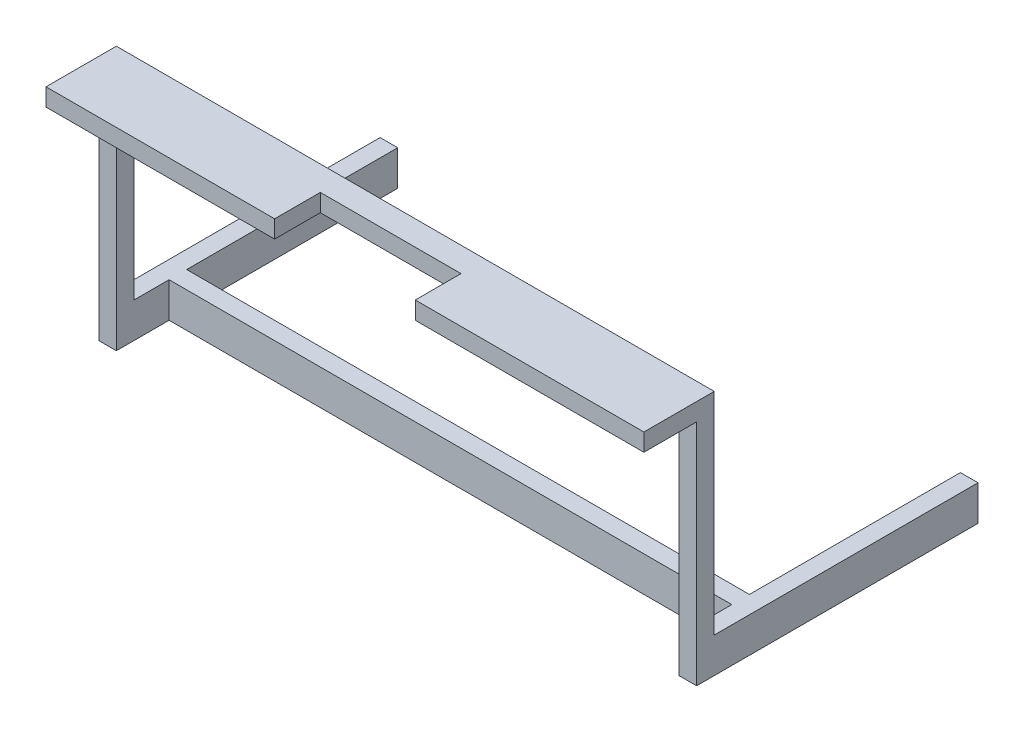
ISO-10303-21;
HEADER;
FILE_DESCRIPTION(('STEP AP214'),'2;1');
FILE_NAME('part.step','',(''),(''),'','','');
FILE_SCHEMA(('AUTOMOTIVE_DESIGN { 1 0 10303 214 1 1 1 1 }'));
ENDSEC;
DATA;
#1=APPLICATION_CONTEXT('core data for automotive mechanical design processes');
#2=APPLICATION_PROTOCOL_DEFINITION('international standard','automotive_design',2000,#1);
#3=PRODUCT_CONTEXT('',#1,'mechanical');
#4=PRODUCT('Part','Part','',(#3));
#5=PRODUCT_RELATED_PRODUCT_CATEGORY('part','',(#4));
#6=PRODUCT_DEFINITION_FORMATION('','',#4);
#7=PRODUCT_DEFINITION_CONTEXT('part definition',#1,'design');
#8=PRODUCT_DEFINITION('design','',#6,#7);
#9=PRODUCT_DEFINITION_SHAPE('','',#8);
#10=(LENGTH_UNIT() NAMED_UNIT(*) SI_UNIT(.MILLI.,.METRE.));
#11=(NAMED_UNIT(*) PLANE_ANGLE_UNIT() SI_UNIT($,.RADIAN.));
#12=(NAMED_UNIT(*) SI_UNIT($,.STERADIAN.) SOLID_ANGLE_UNIT());
#13=UNCERTAINTY_MEASURE_WITH_UNIT(LENGTH_MEASURE(1.E-05),#10,'distance_accuracy_value','');
#14=(GEOMETRIC_REPRESENTATION_CONTEXT(3) GLOBAL_UNCERTAINTY_ASSIGNED_CONTEXT((#13)) GLOBAL_UNIT_ASSIGNED_CONTEXT((#10,
#11,#12)) REPRESENTATION_CONTEXT('',''));
#15=CARTESIAN_POINT('',(0.,0.,0.));
#16=DIRECTION('',(0.,0.,1.));
#17=DIRECTION('',(1.,0.,0.));
#18=AXIS2_PLACEMENT_3D('',#15,#16,#17);
#19=CARTESIAN_POINT('',(170.,70.,15.));
#20=DIRECTION('',(0.,0.,-1.));
#21=DIRECTION('',(0.,1.,0.));
#22=AXIS2_PLACEMENT_3D('',#19,#20,#21);
#23=PLANE('',#22);
#24=DIRECTION('',(-1.,0.,0.));
#25=VECTOR('',#24,1.);
#26=CARTESIAN_POINT('',(170.,65.,15.));
#27=LINE('',#26,#25);
#28=CARTESIAN_POINT('',(65.,65.,15.));
#29=VERTEX_POINT('',#28);
#30=CARTESIAN_POINT('',(0.,65.,15.));
#31=VERTEX_POINT('',#30);
#32=EDGE_CURVE('E206',#29,#31,#27,.T.);
#33=ORIENTED_EDGE('',*,*,#32,.F.);
#34=DIRECTION('',(0.,1.,0.));
#35=VECTOR('',#34,1.);
#36=CARTESIAN_POINT('',(65.,65.,15.));
#37=LINE('',#36,#35);
#38=CARTESIAN_POINT('',(65.,70.,15.));
#39=VERTEX_POINT('',#38);
#40=EDGE_CURVE('E358',#29,#39,#37,.T.);
#41=ORIENTED_EDGE('',*,*,#40,.T.);
#42=DIRECTION('',(-1.,0.,0.));
#43=VECTOR('',#42,1.);
#44=CARTESIAN_POINT('',(170.,70.,15.));
#45=LINE('',#44,#43);
#46=CARTESIAN_POINT('',(0.,70.,15.));
#47=VERTEX_POINT('',#46);
#48=EDGE_CURVE('E205',#39,#47,#45,.T.);
#49=ORIENTED_EDGE('',*,*,#48,.T.);
#50=DIRECTION('',(0.,-1.,0.));
#51=VECTOR('',#50,1.);
#52=CARTESIAN_POINT('',(0.,70.,15.));
#53=LINE('',#52,#51);
#54=EDGE_CURVE('E265',#47,#31,#53,.T.);
#55=ORIENTED_EDGE('',*,*,#54,.T.);
#56=EDGE_LOOP('',(#33,#41,#49,#55));
#57=FACE_BOUND('',#56,.T.);
#58=ADVANCED_FACE('F32',(#57),#23,.F.);
#59=CARTESIAN_POINT('',(170.,0.,0.));
#60=DIRECTION('',(0.,0.,-1.));
#61=DIRECTION('',(-1.,0.,0.));
#62=AXIS2_PLACEMENT_3D('',#59,#60,#61);
#63=PLANE('',#62);
#64=DIRECTION('',(0.,-1.,0.));
#65=VECTOR('',#64,1.);
#66=CARTESIAN_POINT('',(165.,65.,0.));
#67=LINE('',#66,#65);
#68=CARTESIAN_POINT('',(165.,65.,0.));
#69=VERTEX_POINT('',#68);
#70=CARTESIAN_POINT('',(165.,0.,0.));
#71=VERTEX_POINT('',#70);
#72=EDGE_CURVE('E55',#69,#71,#67,.T.);
#73=ORIENTED_EDGE('',*,*,#72,.T.);
#74=DIRECTION('',(-1.,0.,0.));
#75=VECTOR('',#74,1.);
#76=CARTESIAN_POINT('',(170.,0.,0.));
#77=LINE('',#76,#75);
#78=CARTESIAN_POINT('',(170.,0.,0.));
#79=VERTEX_POINT('',#78);
#80=EDGE_CURVE('E11',#79,#71,#77,.T.);
#81=ORIENTED_EDGE('',*,*,#80,.F.);
#82=DIRECTION('',(0.,-1.,0.));
#83=VECTOR('',#82,1.);
#84=CARTESIAN_POINT('',(170.,0.,0.));
#85=LINE('',#84,#83);
#86=CARTESIAN_POINT('',(170.,65.,0.));
#87=VERTEX_POINT('',#86);
#88=EDGE_CURVE('E269',#87,#79,#85,.T.);
#89=ORIENTED_EDGE('',*,*,#88,.F.);
#90=DIRECTION('',(-1.,0.,0.));
#91=VECTOR('',#90,1.);
#92=CARTESIAN_POINT('',(170.,65.,0.));
#93=LINE('',#92,#91);
#94=EDGE_CURVE('E209',#87,#69,#93,.T.);
#95=ORIENTED_EDGE('',*,*,#94,.T.);
#96=EDGE_LOOP('',(#73,#81,#89,#95));
#97=FACE_BOUND('',#96,.T.);
#98=ADVANCED_FACE('F405',(#97),#63,.F.);
#99=CARTESIAN_POINT('',(170.,9.99999999999999,-5.));
#100=DIRECTION('',(0.,0.,1.));
#101=DIRECTION('',(1.,0.,0.));
#102=AXIS2_PLACEMENT_3D('',#99,#100,#101);
#103=PLANE('',#102);
#104=DIRECTION('',(-1.,0.,0.));
#105=VECTOR('',#104,1.);
#106=CARTESIAN_POINT('',(170.,9.99999999999999,-5.));
#107=LINE('',#106,#105);
#108=CARTESIAN_POINT('',(170.,9.99999999999999,-5.));
#109=VERTEX_POINT('',#108);
#110=CARTESIAN_POINT('',(165.,9.99999999999999,-5.));
#111=VERTEX_POINT('',#110);
#112=EDGE_CURVE('E217',#109,#111,#107,.T.);
#113=ORIENTED_EDGE('',*,*,#112,.T.);
#114=DIRECTION('',(0.,-1.,0.));
#115=VECTOR('',#114,1.);
#116=CARTESIAN_POINT('',(165.,65.,-5.));
#117=LINE('',#116,#115);
#118=CARTESIAN_POINT('',(165.,65.,-5.));
#119=VERTEX_POINT('',#118);
#120=EDGE_CURVE('E356',#119,#111,#117,.T.);
#121=ORIENTED_EDGE('',*,*,#120,.F.);
#122=DIRECTION('',(1.,0.,0.));
#123=VECTOR('',#122,1.);
#124=CARTESIAN_POINT('',(5.,65.,-5.));
#125=LINE('',#124,#123);
#126=CARTESIAN_POINT('',(5.,65.,-5.));
#127=VERTEX_POINT('',#126);
#128=EDGE_CURVE('E350',#127,#119,#125,.T.);
#129=ORIENTED_EDGE('',*,*,#128,.F.);
#130=DIRECTION('',(0.,1.,0.));
#131=VECTOR('',#130,1.);
#132=CARTESIAN_POINT('',(5.,9.99999999999999,-5.));
#133=LINE('',#132,#131);
#134=CARTESIAN_POINT('',(5.,9.99999999999999,-5.));
#135=VERTEX_POINT('',#134);
#136=EDGE_CURVE('E353',#135,#127,#133,.T.);
#137=ORIENTED_EDGE('',*,*,#136,.F.);
#138=CARTESIAN_POINT('',(0.,9.99999999999999,-5.));
#139=VERTEX_POINT('',#138);
#140=EDGE_CURVE('E216',#135,#139,#107,.T.);
#141=ORIENTED_EDGE('',*,*,#140,.T.);
#142=DIRECTION('',(0.,1.,0.));
#143=VECTOR('',#142,1.);
#144=CARTESIAN_POINT('',(0.,9.99999999999999,-5.));
#145=LINE('',#144,#143);
#146=CARTESIAN_POINT('',(0.,70.,-5.));
#147=VERTEX_POINT('',#146);
#148=EDGE_CURVE('E257',#139,#147,#145,.T.);
#149=ORIENTED_EDGE('',*,*,#148,.T.);
#150=DIRECTION('',(-1.,0.,0.));
#151=VECTOR('',#150,1.);
#152=CARTESIAN_POINT('',(170.,70.,-5.));
#153=LINE('',#152,#151);
#154=CARTESIAN_POINT('',(170.,70.,-5.));
#155=VERTEX_POINT('',#154);
#156=EDGE_CURVE('E213',#155,#147,#153,.T.);
#157=ORIENTED_EDGE('',*,*,#156,.F.);
#158=DIRECTION('',(0.,1.,0.));
#159=VECTOR('',#158,1.);
#160=CARTESIAN_POINT('',(170.,9.99999999999999,-5.));
#161=LINE('',#160,#159);
#162=EDGE_CURVE('E287',#109,#155,#161,.T.);
#163=ORIENTED_EDGE('',*,*,#162,.F.);
#164=EDGE_LOOP('',(#113,#121,#129,#137,#141,#149,#157,#163));
#165=FACE_BOUND('',#164,.T.);
#166=ADVANCED_FACE('F389',(#165),#103,.F.);
#167=CARTESIAN_POINT('',(170.,0.,-80.));
#168=DIRECTION('',(0.,0.,1.));
#169=DIRECTION('',(1.,0.,0.));
#170=AXIS2_PLACEMENT_3D('',#167,#168,#169);
#171=PLANE('',#170);
#172=DIRECTION('',(-1.,0.,0.));
#173=VECTOR('',#172,1.);
#174=CARTESIAN_POINT('',(170.,10.,-80.));
#175=LINE('',#174,#173);
#176=CARTESIAN_POINT('',(5.,10.,-80.));
#177=VERTEX_POINT('',#176);
#178=CARTESIAN_POINT('',(0.,10.,-80.));
#179=VERTEX_POINT('',#178);
#180=EDGE_CURVE('E220',#177,#179,#175,.T.);
#181=ORIENTED_EDGE('',*,*,#180,.F.);
#182=DIRECTION('',(0.,1.,0.));
#183=VECTOR('',#182,1.);
#184=CARTESIAN_POINT('',(5.,0.,-80.));
#185=LINE('',#184,#183);
#186=CARTESIAN_POINT('',(5.,0.,-80.));
#187=VERTEX_POINT('',#186);
#188=EDGE_CURVE('E239',#187,#177,#185,.T.);
#189=ORIENTED_EDGE('',*,*,#188,.F.);
#190=DIRECTION('',(-1.,0.,0.));
#191=VECTOR('',#190,1.);
#192=CARTESIAN_POINT('',(170.,0.,-80.));
#193=LINE('',#192,#191);
#194=CARTESIAN_POINT('',(0.,0.,-80.));
#195=VERTEX_POINT('',#194);
#196=EDGE_CURVE('E223',#187,#195,#193,.T.);
#197=ORIENTED_EDGE('',*,*,#196,.T.);
#198=DIRECTION('',(0.,1.,0.));
#199=VECTOR('',#198,1.);
#200=CARTESIAN_POINT('',(0.,0.,-80.));
#201=LINE('',#200,#199);
#202=EDGE_CURVE('E238',#195,#179,#201,.T.);
#203=ORIENTED_EDGE('',*,*,#202,.T.);
#204=EDGE_LOOP('',(#181,#189,#197,#203));
#205=FACE_BOUND('',#204,.T.);
#206=ADVANCED_FACE('F236',(#205),#171,.F.);
#207=CARTESIAN_POINT('',(5.,0.,0.));
#208=VERTEX_POINT('',#207);
#209=CARTESIAN_POINT('',(0.,0.,0.));
#210=VERTEX_POINT('',#209);
#211=EDGE_CURVE('E40',#208,#210,#77,.T.);
#212=ORIENTED_EDGE('',*,*,#211,.F.);
#213=DIRECTION('',(0.,1.,0.));
#214=VECTOR('',#213,1.);
#215=CARTESIAN_POINT('',(5.,9.99999999999999,0.));
#216=LINE('',#215,#214);
#217=CARTESIAN_POINT('',(5.,65.,0.));
#218=VERTEX_POINT('',#217);
#219=EDGE_CURVE('E348',#208,#218,#216,.T.);
#220=ORIENTED_EDGE('',*,*,#219,.T.);
#221=CARTESIAN_POINT('',(0.,65.,0.));
#222=VERTEX_POINT('',#221);
#223=EDGE_CURVE('E293',#218,#222,#93,.T.);
#224=ORIENTED_EDGE('',*,*,#223,.T.);
#225=DIRECTION('',(0.,-1.,0.));
#226=VECTOR('',#225,1.);
#227=CARTESIAN_POINT('',(0.,0.,0.));
#228=LINE('',#227,#226);
#229=EDGE_CURVE('E249',#222,#210,#228,.T.);
#230=ORIENTED_EDGE('',*,*,#229,.T.);
#231=EDGE_LOOP('',(#212,#220,#224,#230));
#232=FACE_BOUND('',#231,.T.);
#233=ADVANCED_FACE('F34',(#232),#63,.F.);
#234=CARTESIAN_POINT('',(170.,0.,-20.));
#235=DIRECTION('',(0.,1.,0.));
#236=DIRECTION('',(0.,0.,1.));
#237=AXIS2_PLACEMENT_3D('',#234,#235,#236);
#238=PLANE('',#237);
#239=ORIENTED_EDGE('',*,*,#80,.T.);
#240=DIRECTION('',(0.,0.,-1.));
#241=VECTOR('',#240,1.);
#242=CARTESIAN_POINT('',(165.,0.,-15.));
#243=LINE('',#242,#241);
#244=CARTESIAN_POINT('',(165.,0.,-15.));
#245=VERTEX_POINT('',#244);
#246=EDGE_CURVE('E342',#71,#245,#243,.T.);
#247=ORIENTED_EDGE('',*,*,#246,.T.);
#248=DIRECTION('',(-1.,0.,0.));
#249=VECTOR('',#248,1.);
#250=CARTESIAN_POINT('',(5.00000000000001,0.,-15.));
#251=LINE('',#250,#249);
#252=CARTESIAN_POINT('',(5.00000000000001,0.,-15.));
#253=VERTEX_POINT('',#252);
#254=EDGE_CURVE('E327',#245,#253,#251,.T.);
#255=ORIENTED_EDGE('',*,*,#254,.T.);
#256=DIRECTION('',(0.,0.,1.));
#257=VECTOR('',#256,1.);
#258=CARTESIAN_POINT('',(5.00000000000001,0.,-15.));
#259=LINE('',#258,#257);
#260=EDGE_CURVE('E332',#253,#208,#259,.T.);
#261=ORIENTED_EDGE('',*,*,#260,.T.);
#262=ORIENTED_EDGE('',*,*,#211,.T.);
#263=DIRECTION('',(0.,0.,-1.));
#264=VECTOR('',#263,1.);
#265=CARTESIAN_POINT('',(0.,0.,-20.));
#266=LINE('',#265,#264);
#267=EDGE_CURVE('E243',#210,#195,#266,.T.);
#268=ORIENTED_EDGE('',*,*,#267,.T.);
#269=ORIENTED_EDGE('',*,*,#196,.F.);
#270=DIRECTION('',(0.,0.,1.));
#271=VECTOR('',#270,1.);
#272=CARTESIAN_POINT('',(5.,0.,-80.));
#273=LINE('',#272,#271);
#274=CARTESIAN_POINT('',(5.00000000000001,0.,-20.));
#275=VERTEX_POINT('',#274);
#276=EDGE_CURVE('E316',#187,#275,#273,.T.);
#277=ORIENTED_EDGE('',*,*,#276,.T.);
#278=DIRECTION('',(1.,0.,0.));
#279=VECTOR('',#278,1.);
#280=CARTESIAN_POINT('',(5.00000000000001,0.,-20.));
#281=LINE('',#280,#279);
#282=CARTESIAN_POINT('',(165.,0.,-20.));
#283=VERTEX_POINT('',#282);
#284=EDGE_CURVE('E313',#275,#283,#281,.T.);
#285=ORIENTED_EDGE('',*,*,#284,.T.);
#286=DIRECTION('',(0.,0.,-1.));
#287=VECTOR('',#286,1.);
#288=CARTESIAN_POINT('',(165.,0.,-20.));
#289=LINE('',#288,#287);
#290=CARTESIAN_POINT('',(165.,0.,-80.));
#291=VERTEX_POINT('',#290);
#292=EDGE_CURVE('E308',#283,#291,#289,.T.);
#293=ORIENTED_EDGE('',*,*,#292,.T.);
#294=CARTESIAN_POINT('',(170.,0.,-80.));
#295=VERTEX_POINT('',#294);
#296=EDGE_CURVE('E224',#295,#291,#193,.T.);
#297=ORIENTED_EDGE('',*,*,#296,.F.);
#298=DIRECTION('',(0.,0.,-1.));
#299=VECTOR('',#298,1.);
#300=CARTESIAN_POINT('',(170.,0.,0.));
#301=LINE('',#300,#299);
#302=EDGE_CURVE('E273',#79,#295,#301,.T.);
#303=ORIENTED_EDGE('',*,*,#302,.F.);
#304=EDGE_LOOP('',(#239,#247,#255,#261,#262,#268,#269,#277,#285,#293,#297,#303));
#305=FACE_BOUND('',#304,.T.);
#306=ADVANCED_FACE('F244',(#305),#238,.F.);
#307=ORIENTED_EDGE('',*,*,#296,.T.);
#308=DIRECTION('',(0.,1.,0.));
#309=VECTOR('',#308,1.);
#310=CARTESIAN_POINT('',(165.,0.,-80.));
#311=LINE('',#310,#309);
#312=CARTESIAN_POINT('',(165.,10.,-80.));
#313=VERTEX_POINT('',#312);
#314=EDGE_CURVE('E295',#291,#313,#311,.T.);
#315=ORIENTED_EDGE('',*,*,#314,.T.);
#316=CARTESIAN_POINT('',(170.,10.,-80.));
#317=VERTEX_POINT('',#316);
#318=EDGE_CURVE('E221',#317,#313,#175,.T.);
#319=ORIENTED_EDGE('',*,*,#318,.F.);
#320=DIRECTION('',(0.,1.,0.));
#321=VECTOR('',#320,1.);
#322=CARTESIAN_POINT('',(170.,0.,-80.));
#323=LINE('',#322,#321);
#324=EDGE_CURVE('E278',#295,#317,#323,.T.);
#325=ORIENTED_EDGE('',*,*,#324,.F.);
#326=EDGE_LOOP('',(#307,#315,#319,#325));
#327=FACE_BOUND('',#326,.T.);
#328=ADVANCED_FACE('F399',(#327),#171,.F.);
#329=CARTESIAN_POINT('',(170.,9.99999999999999,-15.));
#330=DIRECTION('',(0.,-1.,0.));
#331=DIRECTION('',(0.,0.,-1.));
#332=AXIS2_PLACEMENT_3D('',#329,#330,#331);
#333=PLANE('',#332);
#334=ORIENTED_EDGE('',*,*,#140,.F.);
#335=DIRECTION('',(0.,0.,1.));
#336=VECTOR('',#335,1.);
#337=CARTESIAN_POINT('',(5.00000000000001,9.99999999999999,-15.));
#338=LINE('',#337,#336);
#339=CARTESIAN_POINT('',(5.00000000000001,9.99999999999999,-15.));
#340=VERTEX_POINT('',#339);
#341=EDGE_CURVE('E336',#340,#135,#338,.T.);
#342=ORIENTED_EDGE('',*,*,#341,.F.);
#343=DIRECTION('',(-1.,0.,0.));
#344=VECTOR('',#343,1.);
#345=CARTESIAN_POINT('',(5.00000000000001,9.99999999999999,-15.));
#346=LINE('',#345,#344);
#347=CARTESIAN_POINT('',(165.,9.99999999999999,-15.));
#348=VERTEX_POINT('',#347);
#349=EDGE_CURVE('E329',#348,#340,#346,.T.);
#350=ORIENTED_EDGE('',*,*,#349,.F.);
#351=DIRECTION('',(0.,0.,-1.));
#352=VECTOR('',#351,1.);
#353=CARTESIAN_POINT('',(165.,9.99999999999999,-15.));
#354=LINE('',#353,#352);
#355=EDGE_CURVE('E333',#111,#348,#354,.T.);
#356=ORIENTED_EDGE('',*,*,#355,.F.);
#357=ORIENTED_EDGE('',*,*,#112,.F.);
#358=DIRECTION('',(0.,0.,1.));
#359=VECTOR('',#358,1.);
#360=CARTESIAN_POINT('',(170.,10.,-80.));
#361=LINE('',#360,#359);
#362=EDGE_CURVE('E285',#317,#109,#361,.T.);
#363=ORIENTED_EDGE('',*,*,#362,.F.);
#364=ORIENTED_EDGE('',*,*,#318,.T.);
#365=DIRECTION('',(0.,0.,-1.));
#366=VECTOR('',#365,1.);
#367=CARTESIAN_POINT('',(165.,9.99999999999999,-20.));
#368=LINE('',#367,#366);
#369=CARTESIAN_POINT('',(165.,9.99999999999999,-20.));
#370=VERTEX_POINT('',#369);
#371=EDGE_CURVE('E302',#370,#313,#368,.T.);
#372=ORIENTED_EDGE('',*,*,#371,.F.);
#373=DIRECTION('',(1.,0.,0.));
#374=VECTOR('',#373,1.);
#375=CARTESIAN_POINT('',(5.00000000000001,9.99999999999999,-20.));
#376=LINE('',#375,#374);
#377=CARTESIAN_POINT('',(5.,9.99999999999999,-20.));
#378=VERTEX_POINT('',#377);
#379=EDGE_CURVE('E321',#378,#370,#376,.T.);
#380=ORIENTED_EDGE('',*,*,#379,.F.);
#381=DIRECTION('',(0.,0.,1.));
#382=VECTOR('',#381,1.);
#383=CARTESIAN_POINT('',(5.,10.,-80.));
#384=LINE('',#383,#382);
#385=EDGE_CURVE('E320',#177,#378,#384,.T.);
#386=ORIENTED_EDGE('',*,*,#385,.F.);
#387=ORIENTED_EDGE('',*,*,#180,.T.);
#388=DIRECTION('',(0.,0.,1.));
#389=VECTOR('',#388,1.);
#390=CARTESIAN_POINT('',(0.,9.99999999999999,-15.));
#391=LINE('',#390,#389);
#392=EDGE_CURVE('E255',#179,#139,#391,.T.);
#393=ORIENTED_EDGE('',*,*,#392,.T.);
#394=EDGE_LOOP('',(#334,#342,#350,#356,#357,#363,#364,#372,#380,#386,#387,#393));
#395=FACE_BOUND('',#394,.T.);
#396=ADVANCED_FACE('F394',(#395),#333,.F.);
#397=CARTESIAN_POINT('',(170.,70.,-5.));
#398=DIRECTION('',(0.,-1.,0.));
#399=DIRECTION('',(0.,0.,-1.));
#400=AXIS2_PLACEMENT_3D('',#397,#398,#399);
#401=PLANE('',#400);
#402=ORIENTED_EDGE('',*,*,#48,.F.);
#403=DIRECTION('',(0.,0.,1.));
#404=VECTOR('',#403,1.);
#405=CARTESIAN_POINT('',(65.,70.,15.));
#406=LINE('',#405,#404);
#407=CARTESIAN_POINT('',(65.,70.,2.00000000000002));
#408=VERTEX_POINT('',#407);
#409=EDGE_CURVE('E189',#408,#39,#406,.T.);
#410=ORIENTED_EDGE('',*,*,#409,.F.);
#411=DIRECTION('',(-1.,0.,0.));
#412=VECTOR('',#411,1.);
#413=CARTESIAN_POINT('',(65.,70.,2.00000000000002));
#414=LINE('',#413,#412);
#415=CARTESIAN_POINT('',(105.,70.,2.00000000000001));
#416=VERTEX_POINT('',#415);
#417=EDGE_CURVE('E368',#416,#408,#414,.T.);
#418=ORIENTED_EDGE('',*,*,#417,.F.);
#419=DIRECTION('',(0.,0.,-1.));
#420=VECTOR('',#419,1.);
#421=CARTESIAN_POINT('',(105.,70.,15.));
#422=LINE('',#421,#420);
#423=CARTESIAN_POINT('',(105.,70.,15.));
#424=VERTEX_POINT('',#423);
#425=EDGE_CURVE('E371',#424,#416,#422,.T.);
#426=ORIENTED_EDGE('',*,*,#425,.F.);
#427=CARTESIAN_POINT('',(170.,70.,15.));
#428=VERTEX_POINT('',#427);
#429=EDGE_CURVE('E199',#428,#424,#45,.T.);
#430=ORIENTED_EDGE('',*,*,#429,.F.);
#431=DIRECTION('',(0.,0.,1.));
#432=VECTOR('',#431,1.);
#433=CARTESIAN_POINT('',(170.,70.,-5.));
#434=LINE('',#433,#432);
#435=EDGE_CURVE('E289',#155,#428,#434,.T.);
#436=ORIENTED_EDGE('',*,*,#435,.F.);
#437=ORIENTED_EDGE('',*,*,#156,.T.);
#438=DIRECTION('',(0.,0.,1.));
#439=VECTOR('',#438,1.);
#440=CARTESIAN_POINT('',(0.,70.,-5.));
#441=LINE('',#440,#439);
#442=EDGE_CURVE('E262',#147,#47,#441,.T.);
#443=ORIENTED_EDGE('',*,*,#442,.T.);
#444=EDGE_LOOP('',(#402,#410,#418,#426,#430,#436,#437,#443));
#445=FACE_BOUND('',#444,.T.);
#446=ADVANCED_FACE('F383',(#445),#401,.F.);
#447=ORIENTED_EDGE('',*,*,#429,.T.);
#448=DIRECTION('',(0.,1.,0.));
#449=VECTOR('',#448,1.);
#450=CARTESIAN_POINT('',(105.,65.,15.));
#451=LINE('',#450,#449);
#452=CARTESIAN_POINT('',(105.,65.,15.));
#453=VERTEX_POINT('',#452);
#454=EDGE_CURVE('E184',#453,#424,#451,.T.);
#455=ORIENTED_EDGE('',*,*,#454,.F.);
#456=CARTESIAN_POINT('',(170.,65.,15.));
#457=VERTEX_POINT('',#456);
#458=EDGE_CURVE('E196',#457,#453,#27,.T.);
#459=ORIENTED_EDGE('',*,*,#458,.F.);
#460=DIRECTION('',(0.,-1.,0.));
#461=VECTOR('',#460,1.);
#462=CARTESIAN_POINT('',(170.,70.,15.));
#463=LINE('',#462,#461);
#464=EDGE_CURVE('E291',#428,#457,#463,.T.);
#465=ORIENTED_EDGE('',*,*,#464,.F.);
#466=EDGE_LOOP('',(#447,#455,#459,#465));
#467=FACE_BOUND('',#466,.T.);
#468=ADVANCED_FACE('F194',(#467),#23,.F.);
#469=CARTESIAN_POINT('',(170.,65.,0.));
#470=DIRECTION('',(0.,1.,0.));
#471=DIRECTION('',(0.,0.,1.));
#472=AXIS2_PLACEMENT_3D('',#469,#470,#471);
#473=PLANE('',#472);
#474=DIRECTION('',(-1.,0.,0.));
#475=VECTOR('',#474,1.);
#476=CARTESIAN_POINT('',(65.,65.,2.00000000000002));
#477=LINE('',#476,#475);
#478=CARTESIAN_POINT('',(105.,65.,2.00000000000001));
#479=VERTEX_POINT('',#478);
#480=CARTESIAN_POINT('',(65.,65.,2.00000000000002));
#481=VERTEX_POINT('',#480);
#482=EDGE_CURVE('E47',#479,#481,#477,.T.);
#483=ORIENTED_EDGE('',*,*,#482,.T.);
#484=DIRECTION('',(0.,0.,1.));
#485=VECTOR('',#484,1.);
#486=CARTESIAN_POINT('',(65.,65.,15.));
#487=LINE('',#486,#485);
#488=EDGE_CURVE('E200',#481,#29,#487,.T.);
#489=ORIENTED_EDGE('',*,*,#488,.T.);
#490=ORIENTED_EDGE('',*,*,#32,.T.);
#491=DIRECTION('',(0.,0.,-1.));
#492=VECTOR('',#491,1.);
#493=CARTESIAN_POINT('',(0.,65.,0.));
#494=LINE('',#493,#492);
#495=EDGE_CURVE('E267',#31,#222,#494,.T.);
#496=ORIENTED_EDGE('',*,*,#495,.T.);
#497=ORIENTED_EDGE('',*,*,#223,.F.);
#498=DIRECTION('',(0.,0.,-1.));
#499=VECTOR('',#498,1.);
#500=CARTESIAN_POINT('',(5.,65.,0.));
#501=LINE('',#500,#499);
#502=EDGE_CURVE('E346',#218,#127,#501,.T.);
#503=ORIENTED_EDGE('',*,*,#502,.T.);
#504=ORIENTED_EDGE('',*,*,#128,.T.);
#505=DIRECTION('',(0.,0.,-1.));
#506=VECTOR('',#505,1.);
#507=CARTESIAN_POINT('',(165.,65.,0.));
#508=LINE('',#507,#506);
#509=EDGE_CURVE('E339',#69,#119,#508,.T.);
#510=ORIENTED_EDGE('',*,*,#509,.F.);
#511=ORIENTED_EDGE('',*,*,#94,.F.);
#512=DIRECTION('',(0.,0.,-1.));
#513=VECTOR('',#512,1.);
#514=CARTESIAN_POINT('',(170.,65.,0.));
#515=LINE('',#514,#513);
#516=EDGE_CURVE('E204',#457,#87,#515,.T.);
#517=ORIENTED_EDGE('',*,*,#516,.F.);
#518=ORIENTED_EDGE('',*,*,#458,.T.);
#519=DIRECTION('',(0.,0.,-1.));
#520=VECTOR('',#519,1.);
#521=CARTESIAN_POINT('',(105.,65.,15.));
#522=LINE('',#521,#520);
#523=EDGE_CURVE('E180',#453,#479,#522,.T.);
#524=ORIENTED_EDGE('',*,*,#523,.T.);
#525=EDGE_LOOP('',(#483,#489,#490,#496,#497,#503,#504,#510,#511,#517,#518,#524));
#526=FACE_BOUND('',#525,.T.);
#527=ADVANCED_FACE('F202',(#526),#473,.F.);
#528=CARTESIAN_POINT('',(170.,0.,0.));
#529=DIRECTION('',(1.,0.,0.));
#530=DIRECTION('',(0.,0.,-1.));
#531=AXIS2_PLACEMENT_3D('',#528,#529,#530);
#532=PLANE('',#531);
#533=ORIENTED_EDGE('',*,*,#88,.T.);
#534=ORIENTED_EDGE('',*,*,#302,.T.);
#535=ORIENTED_EDGE('',*,*,#324,.T.);
#536=ORIENTED_EDGE('',*,*,#362,.T.);
#537=ORIENTED_EDGE('',*,*,#162,.T.);
#538=ORIENTED_EDGE('',*,*,#435,.T.);
#539=ORIENTED_EDGE('',*,*,#464,.T.);
#540=ORIENTED_EDGE('',*,*,#516,.T.);
#541=EDGE_LOOP('',(#533,#534,#535,#536,#537,#538,#539,#540));
#542=FACE_BOUND('',#541,.T.);
#543=ADVANCED_FACE('F403',(#542),#532,.T.);
#544=CARTESIAN_POINT('',(0.,0.,0.));
#545=DIRECTION('',(1.,0.,0.));
#546=DIRECTION('',(0.,0.,-1.));
#547=AXIS2_PLACEMENT_3D('',#544,#545,#546);
#548=PLANE('',#547);
#549=ORIENTED_EDGE('',*,*,#229,.F.);
#550=ORIENTED_EDGE('',*,*,#495,.F.);
#551=ORIENTED_EDGE('',*,*,#54,.F.);
#552=ORIENTED_EDGE('',*,*,#442,.F.);
#553=ORIENTED_EDGE('',*,*,#148,.F.);
#554=ORIENTED_EDGE('',*,*,#392,.F.);
#555=ORIENTED_EDGE('',*,*,#202,.F.);
#556=ORIENTED_EDGE('',*,*,#267,.F.);
#557=EDGE_LOOP('',(#549,#550,#551,#552,#553,#554,#555,#556));
#558=FACE_BOUND('',#557,.T.);
#559=ADVANCED_FACE('F252',(#558),#548,.F.);
#560=CARTESIAN_POINT('',(5.,0.,-80.));
#561=DIRECTION('',(-1.,0.,0.));
#562=DIRECTION('',(0.,0.,1.));
#563=AXIS2_PLACEMENT_3D('',#560,#561,#562);
#564=PLANE('',#563);
#565=ORIENTED_EDGE('',*,*,#385,.T.);
#566=DIRECTION('',(0.,1.,0.));
#567=VECTOR('',#566,1.);
#568=CARTESIAN_POINT('',(5.00000000000001,0.,-20.));
#569=LINE('',#568,#567);
#570=EDGE_CURVE('E281',#275,#378,#569,.T.);
#571=ORIENTED_EDGE('',*,*,#570,.F.);
#572=ORIENTED_EDGE('',*,*,#276,.F.);
#573=ORIENTED_EDGE('',*,*,#188,.T.);
#574=EDGE_LOOP('',(#565,#571,#572,#573));
#575=FACE_BOUND('',#574,.T.);
#576=ADVANCED_FACE('F395',(#575),#564,.F.);
#577=CARTESIAN_POINT('',(165.,0.,-20.));
#578=DIRECTION('',(1.,0.,0.));
#579=DIRECTION('',(0.,0.,-1.));
#580=AXIS2_PLACEMENT_3D('',#577,#578,#579);
#581=PLANE('',#580);
#582=ORIENTED_EDGE('',*,*,#371,.T.);
#583=ORIENTED_EDGE('',*,*,#314,.F.);
#584=ORIENTED_EDGE('',*,*,#292,.F.);
#585=DIRECTION('',(0.,1.,0.));
#586=VECTOR('',#585,1.);
#587=CARTESIAN_POINT('',(165.,0.,-20.));
#588=LINE('',#587,#586);
#589=EDGE_CURVE('E299',#283,#370,#588,.T.);
#590=ORIENTED_EDGE('',*,*,#589,.T.);
#591=EDGE_LOOP('',(#582,#583,#584,#590));
#592=FACE_BOUND('',#591,.T.);
#593=ADVANCED_FACE('F397',(#592),#581,.F.);
#594=CARTESIAN_POINT('',(5.00000000000001,0.,-20.));
#595=DIRECTION('',(0.,0.,1.));
#596=DIRECTION('',(0.,-1.,0.));
#597=AXIS2_PLACEMENT_3D('',#594,#595,#596);
#598=PLANE('',#597);
#599=ORIENTED_EDGE('',*,*,#379,.T.);
#600=ORIENTED_EDGE('',*,*,#589,.F.);
#601=ORIENTED_EDGE('',*,*,#284,.F.);
#602=ORIENTED_EDGE('',*,*,#570,.T.);
#603=EDGE_LOOP('',(#599,#600,#601,#602));
#604=FACE_BOUND('',#603,.T.);
#605=ADVANCED_FACE('F396',(#604),#598,.F.);
#606=CARTESIAN_POINT('',(5.00000000000001,0.,-15.));
#607=DIRECTION('',(-1.,0.,0.));
#608=DIRECTION('',(0.,0.,1.));
#609=AXIS2_PLACEMENT_3D('',#606,#607,#608);
#610=PLANE('',#609);
#611=ORIENTED_EDGE('',*,*,#341,.T.);
#612=ORIENTED_EDGE('',*,*,#136,.T.);
#613=ORIENTED_EDGE('',*,*,#502,.F.);
#614=ORIENTED_EDGE('',*,*,#219,.F.);
#615=ORIENTED_EDGE('',*,*,#260,.F.);
#616=DIRECTION('',(0.,1.,0.));
#617=VECTOR('',#616,1.);
#618=CARTESIAN_POINT('',(5.00000000000001,0.,-15.));
#619=LINE('',#618,#617);
#620=EDGE_CURVE('E322',#253,#340,#619,.T.);
#621=ORIENTED_EDGE('',*,*,#620,.T.);
#622=EDGE_LOOP('',(#611,#612,#613,#614,#615,#621));
#623=FACE_BOUND('',#622,.T.);
#624=ADVANCED_FACE('F410',(#623),#610,.F.);
#625=CARTESIAN_POINT('',(5.00000000000001,0.,-15.));
#626=DIRECTION('',(0.,0.,-1.));
#627=DIRECTION('',(0.,1.,0.));
#628=AXIS2_PLACEMENT_3D('',#625,#626,#627);
#629=PLANE('',#628);
#630=ORIENTED_EDGE('',*,*,#349,.T.);
#631=ORIENTED_EDGE('',*,*,#620,.F.);
#632=ORIENTED_EDGE('',*,*,#254,.F.);
#633=DIRECTION('',(0.,1.,0.));
#634=VECTOR('',#633,1.);
#635=CARTESIAN_POINT('',(165.,0.,-15.));
#636=LINE('',#635,#634);
#637=EDGE_CURVE('E325',#245,#348,#636,.T.);
#638=ORIENTED_EDGE('',*,*,#637,.T.);
#639=EDGE_LOOP('',(#630,#631,#632,#638));
#640=FACE_BOUND('',#639,.T.);
#641=ADVANCED_FACE('F414',(#640),#629,.F.);
#642=CARTESIAN_POINT('',(165.,0.,-15.));
#643=DIRECTION('',(1.,0.,0.));
#644=DIRECTION('',(0.,0.,-1.));
#645=AXIS2_PLACEMENT_3D('',#642,#643,#644);
#646=PLANE('',#645);
#647=ORIENTED_EDGE('',*,*,#355,.T.);
#648=ORIENTED_EDGE('',*,*,#637,.F.);
#649=ORIENTED_EDGE('',*,*,#246,.F.);
#650=ORIENTED_EDGE('',*,*,#72,.F.);
#651=ORIENTED_EDGE('',*,*,#509,.T.);
#652=ORIENTED_EDGE('',*,*,#120,.T.);
#653=EDGE_LOOP('',(#647,#648,#649,#650,#651,#652));
#654=FACE_BOUND('',#653,.T.);
#655=ADVANCED_FACE('F411',(#654),#646,.F.);
#656=CARTESIAN_POINT('',(65.,65.,15.));
#657=DIRECTION('',(-1.,0.,0.));
#658=DIRECTION('',(0.,0.,1.));
#659=AXIS2_PLACEMENT_3D('',#656,#657,#658);
#660=PLANE('',#659);
#661=ORIENTED_EDGE('',*,*,#409,.T.);
#662=ORIENTED_EDGE('',*,*,#40,.F.);
#663=ORIENTED_EDGE('',*,*,#488,.F.);
#664=DIRECTION('',(0.,1.,0.));
#665=VECTOR('',#664,1.);
#666=CARTESIAN_POINT('',(65.,65.,2.00000000000002));
#667=LINE('',#666,#665);
#668=EDGE_CURVE('E363',#481,#408,#667,.T.);
#669=ORIENTED_EDGE('',*,*,#668,.T.);
#670=EDGE_LOOP('',(#661,#662,#663,#669));
#671=FACE_BOUND('',#670,.T.);
#672=ADVANCED_FACE('F423',(#671),#660,.F.);
#673=CARTESIAN_POINT('',(65.,65.,2.00000000000002));
#674=DIRECTION('',(0.,0.,-1.));
#675=DIRECTION('',(-1.,0.,0.));
#676=AXIS2_PLACEMENT_3D('',#673,#674,#675);
#677=PLANE('',#676);
#678=ORIENTED_EDGE('',*,*,#417,.T.);
#679=ORIENTED_EDGE('',*,*,#668,.F.);
#680=ORIENTED_EDGE('',*,*,#482,.F.);
#681=DIRECTION('',(0.,1.,0.));
#682=VECTOR('',#681,1.);
#683=CARTESIAN_POINT('',(105.,65.,2.00000000000001));
#684=LINE('',#683,#682);
#685=EDGE_CURVE('E186',#479,#416,#684,.T.);
#686=ORIENTED_EDGE('',*,*,#685,.T.);
#687=EDGE_LOOP('',(#678,#679,#680,#686));
#688=FACE_BOUND('',#687,.T.);
#689=ADVANCED_FACE('F527',(#688),#677,.F.);
#690=CARTESIAN_POINT('',(105.,65.,15.));
#691=DIRECTION('',(1.,0.,0.));
#692=DIRECTION('',(0.,0.,-1.));
#693=AXIS2_PLACEMENT_3D('',#690,#691,#692);
#694=PLANE('',#693);
#695=ORIENTED_EDGE('',*,*,#425,.T.);
#696=ORIENTED_EDGE('',*,*,#685,.F.);
#697=ORIENTED_EDGE('',*,*,#523,.F.);
#698=ORIENTED_EDGE('',*,*,#454,.T.);
#699=EDGE_LOOP('',(#695,#696,#697,#698));
#700=FACE_BOUND('',#699,.T.);
#701=ADVANCED_FACE('F183',(#700),#694,.F.);
#702=CLOSED_SHELL('',(#58,#98,#166,#206,#233,#306,#328,#396,#446,#468,#527,#543,#559,#576,#593,
#605,#624,#641,#655,#672,#689,#701));
#703=MANIFOLD_SOLID_BREP('B2',#702);
#704=ADVANCED_BREP_SHAPE_REPRESENTATION('',(#18,#703),#14);
#705=SHAPE_DEFINITION_REPRESENTATION(#9,#704);
ENDSEC;
END-ISO-10303-21;
